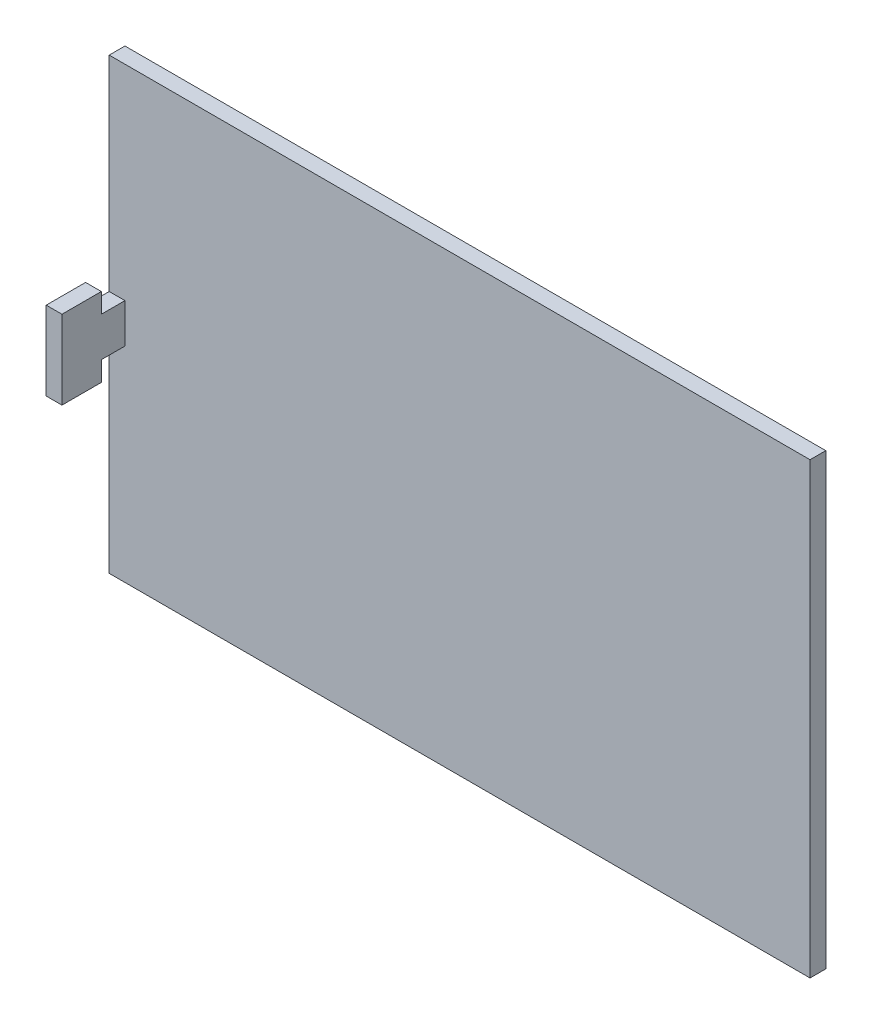
ISO-10303-21;
HEADER;
FILE_DESCRIPTION(('STEP AP214'),'2;1');
FILE_NAME('part.step','',(''),(''),'','','');
FILE_SCHEMA(('AUTOMOTIVE_DESIGN { 1 0 10303 214 1 1 1 1 }'));
ENDSEC;
DATA;
#1=APPLICATION_CONTEXT('core data for automotive mechanical design processes');
#2=APPLICATION_PROTOCOL_DEFINITION('international standard','automotive_design',2000,#1);
#3=PRODUCT_CONTEXT('',#1,'mechanical');
#4=PRODUCT('Part','Part','',(#3));
#5=PRODUCT_RELATED_PRODUCT_CATEGORY('part','',(#4));
#6=PRODUCT_DEFINITION_FORMATION('','',#4);
#7=PRODUCT_DEFINITION_CONTEXT('part definition',#1,'design');
#8=PRODUCT_DEFINITION('design','',#6,#7);
#9=PRODUCT_DEFINITION_SHAPE('','',#8);
#10=(LENGTH_UNIT() NAMED_UNIT(*) SI_UNIT(.MILLI.,.METRE.));
#11=(NAMED_UNIT(*) PLANE_ANGLE_UNIT() SI_UNIT($,.RADIAN.));
#12=(NAMED_UNIT(*) SI_UNIT($,.STERADIAN.) SOLID_ANGLE_UNIT());
#13=UNCERTAINTY_MEASURE_WITH_UNIT(LENGTH_MEASURE(1.E-05),#10,'distance_accuracy_value','');
#14=(GEOMETRIC_REPRESENTATION_CONTEXT(3) GLOBAL_UNCERTAINTY_ASSIGNED_CONTEXT((#13)) GLOBAL_UNIT_ASSIGNED_CONTEXT((#10,
#11,#12)) REPRESENTATION_CONTEXT('',''));
#15=CARTESIAN_POINT('',(0.,0.,0.));
#16=DIRECTION('',(0.,0.,1.));
#17=DIRECTION('',(1.,0.,0.));
#18=AXIS2_PLACEMENT_3D('',#15,#16,#17);
#19=CARTESIAN_POINT('',(-75.6383426966293,24.3370786516854,2.));
#20=DIRECTION('',(1.,0.,0.));
#21=DIRECTION('',(0.,0.,-1.));
#22=AXIS2_PLACEMENT_3D('',#19,#20,#21);
#23=PLANE('',#22);
#24=DIRECTION('',(0.,-1.,0.));
#25=VECTOR('',#24,1.);
#26=CARTESIAN_POINT('',(-75.6383426966293,24.3370786516854,0.));
#27=LINE('',#26,#25);
#28=CARTESIAN_POINT('',(-75.6383426966293,24.3370786516854,0.));
#29=VERTEX_POINT('',#28);
#30=CARTESIAN_POINT('',(-75.6383426966293,-32.6629213483146,0.));
#31=VERTEX_POINT('',#30);
#32=EDGE_CURVE('E193',#29,#31,#27,.T.);
#33=ORIENTED_EDGE('',*,*,#32,.T.);
#34=DIRECTION('',(0.,0.,-1.));
#35=VECTOR('',#34,1.);
#36=CARTESIAN_POINT('',(-75.6383426966293,-32.6629213483146,2.));
#37=LINE('',#36,#35);
#38=CARTESIAN_POINT('',(-75.6383426966293,-32.6629213483146,2.));
#39=VERTEX_POINT('',#38);
#40=EDGE_CURVE('E11',#39,#31,#37,.T.);
#41=ORIENTED_EDGE('',*,*,#40,.F.);
#42=DIRECTION('',(0.,-1.,0.));
#43=VECTOR('',#42,1.);
#44=CARTESIAN_POINT('',(-75.6383426966293,24.3370786516854,2.));
#45=LINE('',#44,#43);
#46=CARTESIAN_POINT('',(-75.6383426966293,-6.6629213483146,2.));
#47=VERTEX_POINT('',#46);
#48=EDGE_CURVE('E198',#47,#39,#45,.T.);
#49=ORIENTED_EDGE('',*,*,#48,.F.);
#50=DIRECTION('',(0.,0.,-1.));
#51=VECTOR('',#50,1.);
#52=CARTESIAN_POINT('',(-75.6383426966293,-6.66292134831461,5.));
#53=LINE('',#52,#51);
#54=CARTESIAN_POINT('',(-75.6383426966293,-6.66292134831461,5.));
#55=VERTEX_POINT('',#54);
#56=EDGE_CURVE('E189',#55,#47,#53,.T.);
#57=ORIENTED_EDGE('',*,*,#56,.F.);
#58=DIRECTION('',(0.,-1.,0.));
#59=VECTOR('',#58,1.);
#60=CARTESIAN_POINT('',(-75.6383426966293,0.837078651685398,5.));
#61=LINE('',#60,#59);
#62=CARTESIAN_POINT('',(-75.6383426966293,-9.1629213483146,5.));
#63=VERTEX_POINT('',#62);
#64=EDGE_CURVE('E153',#55,#63,#61,.T.);
#65=ORIENTED_EDGE('',*,*,#64,.T.);
#66=DIRECTION('',(0.,0.,-1.));
#67=VECTOR('',#66,1.);
#68=CARTESIAN_POINT('',(-75.6383426966293,-9.1629213483146,10.));
#69=LINE('',#68,#67);
#70=CARTESIAN_POINT('',(-75.6383426966293,-9.1629213483146,10.));
#71=VERTEX_POINT('',#70);
#72=EDGE_CURVE('E131',#71,#63,#69,.T.);
#73=ORIENTED_EDGE('',*,*,#72,.F.);
#74=DIRECTION('',(0.,-1.,0.));
#75=VECTOR('',#74,1.);
#76=CARTESIAN_POINT('',(-75.6383426966293,0.837078651685398,10.));
#77=LINE('',#76,#75);
#78=CARTESIAN_POINT('',(-75.6383426966293,0.837078651685398,10.));
#79=VERTEX_POINT('',#78);
#80=EDGE_CURVE('E138',#79,#71,#77,.T.);
#81=ORIENTED_EDGE('',*,*,#80,.F.);
#82=DIRECTION('',(0.,0.,-1.));
#83=VECTOR('',#82,1.);
#84=CARTESIAN_POINT('',(-75.6383426966293,0.837078651685398,10.));
#85=LINE('',#84,#83);
#86=CARTESIAN_POINT('',(-75.6383426966293,0.837078651685398,5.));
#87=VERTEX_POINT('',#86);
#88=EDGE_CURVE('E277',#79,#87,#85,.T.);
#89=ORIENTED_EDGE('',*,*,#88,.T.);
#90=CARTESIAN_POINT('',(-75.6383426966293,-1.66292134831461,5.));
#91=VERTEX_POINT('',#90);
#92=EDGE_CURVE('E264',#87,#91,#61,.T.);
#93=ORIENTED_EDGE('',*,*,#92,.T.);
#94=DIRECTION('',(0.,0.,-1.));
#95=VECTOR('',#94,1.);
#96=CARTESIAN_POINT('',(-75.6383426966293,-1.66292134831461,5.));
#97=LINE('',#96,#95);
#98=CARTESIAN_POINT('',(-75.6383426966293,-1.6629213483146,2.));
#99=VERTEX_POINT('',#98);
#100=EDGE_CURVE('E172',#91,#99,#97,.T.);
#101=ORIENTED_EDGE('',*,*,#100,.T.);
#102=CARTESIAN_POINT('',(-75.6383426966293,24.3370786516854,2.));
#103=VERTEX_POINT('',#102);
#104=EDGE_CURVE('E194',#103,#99,#45,.T.);
#105=ORIENTED_EDGE('',*,*,#104,.F.);
#106=DIRECTION('',(0.,0.,-1.));
#107=VECTOR('',#106,1.);
#108=CARTESIAN_POINT('',(-75.6383426966293,24.3370786516854,2.));
#109=LINE('',#108,#107);
#110=EDGE_CURVE('E207',#103,#29,#109,.T.);
#111=ORIENTED_EDGE('',*,*,#110,.T.);
#112=EDGE_LOOP('',(#33,#41,#49,#57,#65,#73,#81,#89,#93,#101,#105,#111));
#113=FACE_BOUND('',#112,.T.);
#114=ADVANCED_FACE('F39',(#113),#23,.F.);
#115=CARTESIAN_POINT('',(-75.6383426966293,-32.6629213483146,2.));
#116=DIRECTION('',(0.,1.,0.));
#117=DIRECTION('',(0.,0.,1.));
#118=AXIS2_PLACEMENT_3D('',#115,#116,#117);
#119=PLANE('',#118);
#120=DIRECTION('',(1.,0.,0.));
#121=VECTOR('',#120,1.);
#122=CARTESIAN_POINT('',(-75.6383426966293,-32.6629213483146,0.));
#123=LINE('',#122,#121);
#124=CARTESIAN_POINT('',(13.3616573033707,-32.6629213483146,0.));
#125=VERTEX_POINT('',#124);
#126=EDGE_CURVE('E210',#31,#125,#123,.T.);
#127=ORIENTED_EDGE('',*,*,#126,.T.);
#128=DIRECTION('',(0.,0.,-1.));
#129=VECTOR('',#128,1.);
#130=CARTESIAN_POINT('',(13.3616573033707,-32.6629213483146,2.));
#131=LINE('',#130,#129);
#132=CARTESIAN_POINT('',(13.3616573033707,-32.6629213483146,2.));
#133=VERTEX_POINT('',#132);
#134=EDGE_CURVE('E47',#133,#125,#131,.T.);
#135=ORIENTED_EDGE('',*,*,#134,.F.);
#136=DIRECTION('',(1.,0.,0.));
#137=VECTOR('',#136,1.);
#138=CARTESIAN_POINT('',(-75.6383426966293,-32.6629213483146,2.));
#139=LINE('',#138,#137);
#140=EDGE_CURVE('E197',#39,#133,#139,.T.);
#141=ORIENTED_EDGE('',*,*,#140,.F.);
#142=ORIENTED_EDGE('',*,*,#40,.T.);
#143=EDGE_LOOP('',(#127,#135,#141,#142));
#144=FACE_BOUND('',#143,.T.);
#145=ADVANCED_FACE('F299',(#144),#119,.F.);
#146=CARTESIAN_POINT('',(13.3616573033707,24.3370786516854,2.));
#147=DIRECTION('',(-1.,0.,0.));
#148=DIRECTION('',(0.,0.,1.));
#149=AXIS2_PLACEMENT_3D('',#146,#147,#148);
#150=PLANE('',#149);
#151=DIRECTION('',(0.,1.,0.));
#152=VECTOR('',#151,1.);
#153=CARTESIAN_POINT('',(13.3616573033707,24.3370786516854,0.));
#154=LINE('',#153,#152);
#155=CARTESIAN_POINT('',(13.3616573033707,24.3370786516854,0.));
#156=VERTEX_POINT('',#155);
#157=EDGE_CURVE('E213',#125,#156,#154,.T.);
#158=ORIENTED_EDGE('',*,*,#157,.T.);
#159=DIRECTION('',(0.,0.,-1.));
#160=VECTOR('',#159,1.);
#161=CARTESIAN_POINT('',(13.3616573033707,24.3370786516854,2.));
#162=LINE('',#161,#160);
#163=CARTESIAN_POINT('',(13.3616573033707,24.3370786516854,2.));
#164=VERTEX_POINT('',#163);
#165=EDGE_CURVE('E222',#164,#156,#162,.T.);
#166=ORIENTED_EDGE('',*,*,#165,.F.);
#167=DIRECTION('',(0.,1.,0.));
#168=VECTOR('',#167,1.);
#169=CARTESIAN_POINT('',(13.3616573033707,24.3370786516854,2.));
#170=LINE('',#169,#168);
#171=EDGE_CURVE('E201',#133,#164,#170,.T.);
#172=ORIENTED_EDGE('',*,*,#171,.F.);
#173=ORIENTED_EDGE('',*,*,#134,.T.);
#174=EDGE_LOOP('',(#158,#166,#172,#173));
#175=FACE_BOUND('',#174,.T.);
#176=ADVANCED_FACE('F231',(#175),#150,.F.);
#177=CARTESIAN_POINT('',(-75.6383426966293,24.3370786516854,2.));
#178=DIRECTION('',(0.,-1.,0.));
#179=DIRECTION('',(0.,0.,-1.));
#180=AXIS2_PLACEMENT_3D('',#177,#178,#179);
#181=PLANE('',#180);
#182=DIRECTION('',(-1.,0.,0.));
#183=VECTOR('',#182,1.);
#184=CARTESIAN_POINT('',(-75.6383426966293,24.3370786516854,0.));
#185=LINE('',#184,#183);
#186=EDGE_CURVE('E216',#156,#29,#185,.T.);
#187=ORIENTED_EDGE('',*,*,#186,.T.);
#188=ORIENTED_EDGE('',*,*,#110,.F.);
#189=DIRECTION('',(-1.,0.,0.));
#190=VECTOR('',#189,1.);
#191=CARTESIAN_POINT('',(-75.6383426966293,24.3370786516854,2.));
#192=LINE('',#191,#190);
#193=EDGE_CURVE('E204',#164,#103,#192,.T.);
#194=ORIENTED_EDGE('',*,*,#193,.F.);
#195=ORIENTED_EDGE('',*,*,#165,.T.);
#196=EDGE_LOOP('',(#187,#188,#194,#195));
#197=FACE_BOUND('',#196,.T.);
#198=ADVANCED_FACE('F241',(#197),#181,.F.);
#199=CARTESIAN_POINT('',(0.,0.,2.));
#200=DIRECTION('',(0.,0.,1.));
#201=DIRECTION('',(1.,0.,0.));
#202=AXIS2_PLACEMENT_3D('',#199,#200,#201);
#203=PLANE('',#202);
#204=DIRECTION('',(-1.,0.,0.));
#205=VECTOR('',#204,1.);
#206=CARTESIAN_POINT('',(-75.6383426966293,-1.66292134831461,2.));
#207=LINE('',#206,#205);
#208=CARTESIAN_POINT('',(-73.6383426966293,-1.66292134831461,2.));
#209=VERTEX_POINT('',#208);
#210=EDGE_CURVE('E54',#209,#99,#207,.T.);
#211=ORIENTED_EDGE('',*,*,#210,.F.);
#212=DIRECTION('',(0.,1.,0.));
#213=VECTOR('',#212,1.);
#214=CARTESIAN_POINT('',(-73.6383426966293,-1.66292134831461,2.));
#215=LINE('',#214,#213);
#216=CARTESIAN_POINT('',(-73.6383426966293,-6.66292134831461,2.));
#217=VERTEX_POINT('',#216);
#218=EDGE_CURVE('E159',#217,#209,#215,.T.);
#219=ORIENTED_EDGE('',*,*,#218,.F.);
#220=DIRECTION('',(1.,0.,0.));
#221=VECTOR('',#220,1.);
#222=CARTESIAN_POINT('',(-75.6383426966293,-6.66292134831461,2.));
#223=LINE('',#222,#221);
#224=EDGE_CURVE('E60',#47,#217,#223,.T.);
#225=ORIENTED_EDGE('',*,*,#224,.F.);
#226=ORIENTED_EDGE('',*,*,#48,.T.);
#227=ORIENTED_EDGE('',*,*,#140,.T.);
#228=ORIENTED_EDGE('',*,*,#171,.T.);
#229=ORIENTED_EDGE('',*,*,#193,.T.);
#230=ORIENTED_EDGE('',*,*,#104,.T.);
#231=EDGE_LOOP('',(#211,#219,#225,#226,#227,#228,#229,#230));
#232=FACE_BOUND('',#231,.T.);
#233=ADVANCED_FACE('F246',(#232),#203,.T.);
#234=CARTESIAN_POINT('',(0.,0.,0.));
#235=DIRECTION('',(0.,0.,1.));
#236=DIRECTION('',(1.,0.,0.));
#237=AXIS2_PLACEMENT_3D('',#234,#235,#236);
#238=PLANE('',#237);
#239=ORIENTED_EDGE('',*,*,#32,.F.);
#240=ORIENTED_EDGE('',*,*,#186,.F.);
#241=ORIENTED_EDGE('',*,*,#157,.F.);
#242=ORIENTED_EDGE('',*,*,#126,.F.);
#243=EDGE_LOOP('',(#239,#240,#241,#242));
#244=FACE_BOUND('',#243,.T.);
#245=ADVANCED_FACE('F238',(#244),#238,.F.);
#246=CARTESIAN_POINT('',(-75.6383426966293,-6.66292134831461,5.));
#247=DIRECTION('',(0.,1.,0.));
#248=DIRECTION('',(0.,0.,1.));
#249=AXIS2_PLACEMENT_3D('',#246,#247,#248);
#250=PLANE('',#249);
#251=ORIENTED_EDGE('',*,*,#224,.T.);
#252=DIRECTION('',(0.,0.,-1.));
#253=VECTOR('',#252,1.);
#254=CARTESIAN_POINT('',(-73.6383426966293,-6.66292134831461,5.));
#255=LINE('',#254,#253);
#256=CARTESIAN_POINT('',(-73.6383426966293,-6.66292134831461,5.));
#257=VERTEX_POINT('',#256);
#258=EDGE_CURVE('E185',#257,#217,#255,.T.);
#259=ORIENTED_EDGE('',*,*,#258,.F.);
#260=DIRECTION('',(1.,0.,0.));
#261=VECTOR('',#260,1.);
#262=CARTESIAN_POINT('',(-75.6383426966293,-6.66292134831461,5.));
#263=LINE('',#262,#261);
#264=EDGE_CURVE('E165',#55,#257,#263,.T.);
#265=ORIENTED_EDGE('',*,*,#264,.F.);
#266=ORIENTED_EDGE('',*,*,#56,.T.);
#267=EDGE_LOOP('',(#251,#259,#265,#266));
#268=FACE_BOUND('',#267,.T.);
#269=ADVANCED_FACE('F258',(#268),#250,.F.);
#270=CARTESIAN_POINT('',(-73.6383426966293,-1.66292134831461,5.));
#271=DIRECTION('',(-1.,0.,0.));
#272=DIRECTION('',(0.,0.,1.));
#273=AXIS2_PLACEMENT_3D('',#270,#271,#272);
#274=PLANE('',#273);
#275=ORIENTED_EDGE('',*,*,#218,.T.);
#276=DIRECTION('',(0.,0.,-1.));
#277=VECTOR('',#276,1.);
#278=CARTESIAN_POINT('',(-73.6383426966293,-1.66292134831461,5.));
#279=LINE('',#278,#277);
#280=CARTESIAN_POINT('',(-73.6383426966293,-1.66292134831461,5.));
#281=VERTEX_POINT('',#280);
#282=EDGE_CURVE('E181',#281,#209,#279,.T.);
#283=ORIENTED_EDGE('',*,*,#282,.F.);
#284=DIRECTION('',(0.,1.,0.));
#285=VECTOR('',#284,1.);
#286=CARTESIAN_POINT('',(-73.6383426966293,0.837078651685398,5.));
#287=LINE('',#286,#285);
#288=CARTESIAN_POINT('',(-73.6383426966293,0.837078651685398,5.));
#289=VERTEX_POINT('',#288);
#290=EDGE_CURVE('E254',#281,#289,#287,.T.);
#291=ORIENTED_EDGE('',*,*,#290,.T.);
#292=DIRECTION('',(0.,0.,-1.));
#293=VECTOR('',#292,1.);
#294=CARTESIAN_POINT('',(-73.6383426966293,0.837078651685398,10.));
#295=LINE('',#294,#293);
#296=CARTESIAN_POINT('',(-73.6383426966293,0.837078651685398,10.));
#297=VERTEX_POINT('',#296);
#298=EDGE_CURVE('E161',#297,#289,#295,.T.);
#299=ORIENTED_EDGE('',*,*,#298,.F.);
#300=DIRECTION('',(0.,1.,0.));
#301=VECTOR('',#300,1.);
#302=CARTESIAN_POINT('',(-73.6383426966293,0.837078651685398,10.));
#303=LINE('',#302,#301);
#304=CARTESIAN_POINT('',(-73.6383426966293,-9.1629213483146,10.));
#305=VERTEX_POINT('',#304);
#306=EDGE_CURVE('E137',#305,#297,#303,.T.);
#307=ORIENTED_EDGE('',*,*,#306,.F.);
#308=DIRECTION('',(0.,0.,-1.));
#309=VECTOR('',#308,1.);
#310=CARTESIAN_POINT('',(-73.6383426966293,-9.1629213483146,10.));
#311=LINE('',#310,#309);
#312=CARTESIAN_POINT('',(-73.6383426966293,-9.1629213483146,5.));
#313=VERTEX_POINT('',#312);
#314=EDGE_CURVE('E133',#305,#313,#311,.T.);
#315=ORIENTED_EDGE('',*,*,#314,.T.);
#316=EDGE_CURVE('E272',#313,#257,#287,.T.);
#317=ORIENTED_EDGE('',*,*,#316,.T.);
#318=ORIENTED_EDGE('',*,*,#258,.T.);
#319=EDGE_LOOP('',(#275,#283,#291,#299,#307,#315,#317,#318));
#320=FACE_BOUND('',#319,.T.);
#321=ADVANCED_FACE('F252',(#320),#274,.F.);
#322=CARTESIAN_POINT('',(-75.6383426966293,-1.66292134831461,5.));
#323=DIRECTION('',(0.,-1.,0.));
#324=DIRECTION('',(0.,0.,-1.));
#325=AXIS2_PLACEMENT_3D('',#322,#323,#324);
#326=PLANE('',#325);
#327=ORIENTED_EDGE('',*,*,#210,.T.);
#328=ORIENTED_EDGE('',*,*,#100,.F.);
#329=DIRECTION('',(-1.,0.,0.));
#330=VECTOR('',#329,1.);
#331=CARTESIAN_POINT('',(-75.6383426966293,-1.66292134831461,5.));
#332=LINE('',#331,#330);
#333=EDGE_CURVE('E169',#281,#91,#332,.T.);
#334=ORIENTED_EDGE('',*,*,#333,.F.);
#335=ORIENTED_EDGE('',*,*,#282,.T.);
#336=EDGE_LOOP('',(#327,#328,#334,#335));
#337=FACE_BOUND('',#336,.T.);
#338=ADVANCED_FACE('F248',(#337),#326,.F.);
#339=CARTESIAN_POINT('',(0.,0.,5.));
#340=DIRECTION('',(0.,0.,1.));
#341=DIRECTION('',(1.,0.,0.));
#342=AXIS2_PLACEMENT_3D('',#339,#340,#341);
#343=PLANE('',#342);
#344=ORIENTED_EDGE('',*,*,#64,.F.);
#345=ORIENTED_EDGE('',*,*,#264,.T.);
#346=ORIENTED_EDGE('',*,*,#316,.F.);
#347=DIRECTION('',(1.,0.,0.));
#348=VECTOR('',#347,1.);
#349=CARTESIAN_POINT('',(-75.6383426966293,-9.1629213483146,5.));
#350=LINE('',#349,#348);
#351=EDGE_CURVE('E262',#63,#313,#350,.T.);
#352=ORIENTED_EDGE('',*,*,#351,.F.);
#353=EDGE_LOOP('',(#344,#345,#346,#352));
#354=FACE_BOUND('',#353,.T.);
#355=ADVANCED_FACE('F260',(#354),#343,.F.);
#356=ORIENTED_EDGE('',*,*,#290,.F.);
#357=ORIENTED_EDGE('',*,*,#333,.T.);
#358=ORIENTED_EDGE('',*,*,#92,.F.);
#359=DIRECTION('',(-1.,0.,0.));
#360=VECTOR('',#359,1.);
#361=CARTESIAN_POINT('',(-75.6383426966293,0.837078651685398,5.));
#362=LINE('',#361,#360);
#363=EDGE_CURVE('E148',#289,#87,#362,.T.);
#364=ORIENTED_EDGE('',*,*,#363,.F.);
#365=EDGE_LOOP('',(#356,#357,#358,#364));
#366=FACE_BOUND('',#365,.T.);
#367=ADVANCED_FACE('F285',(#366),#343,.F.);
#368=CARTESIAN_POINT('',(-75.6383426966293,-9.1629213483146,10.));
#369=DIRECTION('',(0.,1.,0.));
#370=DIRECTION('',(0.,0.,1.));
#371=AXIS2_PLACEMENT_3D('',#368,#369,#370);
#372=PLANE('',#371);
#373=ORIENTED_EDGE('',*,*,#351,.T.);
#374=ORIENTED_EDGE('',*,*,#314,.F.);
#375=DIRECTION('',(1.,0.,0.));
#376=VECTOR('',#375,1.);
#377=CARTESIAN_POINT('',(-75.6383426966293,-9.1629213483146,10.));
#378=LINE('',#377,#376);
#379=EDGE_CURVE('E127',#71,#305,#378,.T.);
#380=ORIENTED_EDGE('',*,*,#379,.F.);
#381=ORIENTED_EDGE('',*,*,#72,.T.);
#382=EDGE_LOOP('',(#373,#374,#380,#381));
#383=FACE_BOUND('',#382,.T.);
#384=ADVANCED_FACE('F129',(#383),#372,.F.);
#385=CARTESIAN_POINT('',(-75.6383426966293,0.837078651685398,10.));
#386=DIRECTION('',(0.,-1.,0.));
#387=DIRECTION('',(0.,0.,-1.));
#388=AXIS2_PLACEMENT_3D('',#385,#386,#387);
#389=PLANE('',#388);
#390=ORIENTED_EDGE('',*,*,#363,.T.);
#391=ORIENTED_EDGE('',*,*,#88,.F.);
#392=DIRECTION('',(-1.,0.,0.));
#393=VECTOR('',#392,1.);
#394=CARTESIAN_POINT('',(-75.6383426966293,0.837078651685398,10.));
#395=LINE('',#394,#393);
#396=EDGE_CURVE('E143',#297,#79,#395,.T.);
#397=ORIENTED_EDGE('',*,*,#396,.F.);
#398=ORIENTED_EDGE('',*,*,#298,.T.);
#399=EDGE_LOOP('',(#390,#391,#397,#398));
#400=FACE_BOUND('',#399,.T.);
#401=ADVANCED_FACE('F282',(#400),#389,.F.);
#402=CARTESIAN_POINT('',(0.,0.,10.));
#403=DIRECTION('',(0.,0.,1.));
#404=DIRECTION('',(1.,0.,0.));
#405=AXIS2_PLACEMENT_3D('',#402,#403,#404);
#406=PLANE('',#405);
#407=ORIENTED_EDGE('',*,*,#80,.T.);
#408=ORIENTED_EDGE('',*,*,#379,.T.);
#409=ORIENTED_EDGE('',*,*,#306,.T.);
#410=ORIENTED_EDGE('',*,*,#396,.T.);
#411=EDGE_LOOP('',(#407,#408,#409,#410));
#412=FACE_BOUND('',#411,.T.);
#413=ADVANCED_FACE('F141',(#412),#406,.T.);
#414=CLOSED_SHELL('',(#114,#145,#176,#198,#233,#245,#269,#321,#338,#355,#367,#384,#401,#413));
#415=MANIFOLD_SOLID_BREP('B2',#414);
#416=ADVANCED_BREP_SHAPE_REPRESENTATION('',(#18,#415),#14);
#417=SHAPE_DEFINITION_REPRESENTATION(#9,#416);
ENDSEC;
END-ISO-10303-21;
